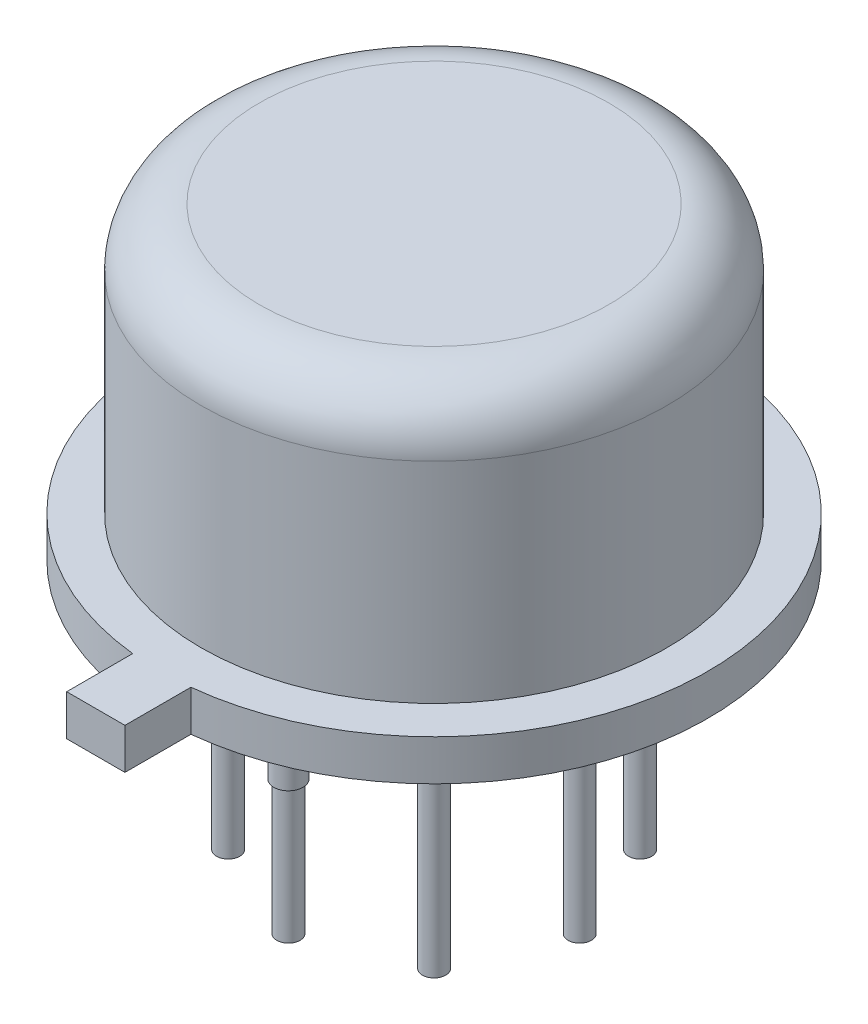
ISO-10303-21;
HEADER;
FILE_DESCRIPTION(('STEP AP214'),'2;1');
FILE_NAME('part.step','',(''),(''),'','','');
FILE_SCHEMA(('AUTOMOTIVE_DESIGN { 1 0 10303 214 1 1 1 1 }'));
ENDSEC;
DATA;
#1=APPLICATION_CONTEXT('core data for automotive mechanical design processes');
#2=APPLICATION_PROTOCOL_DEFINITION('international standard','automotive_design',2000,#1);
#3=PRODUCT_CONTEXT('',#1,'mechanical');
#4=PRODUCT('Part','Part','',(#3));
#5=PRODUCT_RELATED_PRODUCT_CATEGORY('part','',(#4));
#6=PRODUCT_DEFINITION_FORMATION('','',#4);
#7=PRODUCT_DEFINITION_CONTEXT('part definition',#1,'design');
#8=PRODUCT_DEFINITION('design','',#6,#7);
#9=PRODUCT_DEFINITION_SHAPE('','',#8);
#10=(LENGTH_UNIT() NAMED_UNIT(*) SI_UNIT(.MILLI.,.METRE.));
#11=(NAMED_UNIT(*) PLANE_ANGLE_UNIT() SI_UNIT($,.RADIAN.));
#12=(NAMED_UNIT(*) SI_UNIT($,.STERADIAN.) SOLID_ANGLE_UNIT());
#13=UNCERTAINTY_MEASURE_WITH_UNIT(LENGTH_MEASURE(1.E-05),#10,'distance_accuracy_value','');
#14=(GEOMETRIC_REPRESENTATION_CONTEXT(3) GLOBAL_UNCERTAINTY_ASSIGNED_CONTEXT((#13)) GLOBAL_UNIT_ASSIGNED_CONTEXT((#10,
#11,#12)) REPRESENTATION_CONTEXT('',''));
#15=CARTESIAN_POINT('',(0.,0.,0.));
#16=DIRECTION('',(0.,0.,1.));
#17=DIRECTION('',(1.,0.,0.));
#18=AXIS2_PLACEMENT_3D('',#15,#16,#17);
#19=CARTESIAN_POINT('',(0.,0.7,5.806112013031));
#20=DIRECTION('',(0.,0.,-1.));
#21=DIRECTION('',(-1.,0.,0.));
#22=AXIS2_PLACEMENT_3D('',#19,#20,#21);
#23=PLANE('',#22);
#24=DIRECTION('',(1.,0.,0.));
#25=VECTOR('',#24,1.);
#26=CARTESIAN_POINT('',(0.,0.,5.806112013031));
#27=LINE('',#26,#25);
#28=CARTESIAN_POINT('',(-0.499999999999999,0.,5.806112013031));
#29=VERTEX_POINT('',#28);
#30=CARTESIAN_POINT('',(0.500000000000001,0.,5.806112013031));
#31=VERTEX_POINT('',#30);
#32=EDGE_CURVE('E83',#29,#31,#27,.T.);
#33=ORIENTED_EDGE('',*,*,#32,.T.);
#34=DIRECTION('',(0.,-1.,0.));
#35=VECTOR('',#34,1.);
#36=CARTESIAN_POINT('',(0.500000000000001,0.7,5.806112013031));
#37=LINE('',#36,#35);
#38=CARTESIAN_POINT('',(0.500000000000001,0.7,5.806112013031));
#39=VERTEX_POINT('',#38);
#40=EDGE_CURVE('E104',#39,#31,#37,.T.);
#41=ORIENTED_EDGE('',*,*,#40,.F.);
#42=DIRECTION('',(1.,0.,0.));
#43=VECTOR('',#42,1.);
#44=CARTESIAN_POINT('',(0.,0.7,5.806112013031));
#45=LINE('',#44,#43);
#46=CARTESIAN_POINT('',(-0.499999999999999,0.7,5.806112013031));
#47=VERTEX_POINT('',#46);
#48=EDGE_CURVE('E88',#47,#39,#45,.T.);
#49=ORIENTED_EDGE('',*,*,#48,.F.);
#50=DIRECTION('',(0.,-1.,0.));
#51=VECTOR('',#50,1.);
#52=CARTESIAN_POINT('',(-0.499999999999999,0.7,5.806112013031));
#53=LINE('',#52,#51);
#54=EDGE_CURVE('E113',#47,#29,#53,.T.);
#55=ORIENTED_EDGE('',*,*,#54,.T.);
#56=EDGE_LOOP('',(#33,#41,#49,#55));
#57=FACE_BOUND('',#56,.T.);
#58=ADVANCED_FACE('F41',(#57),#23,.F.);
#59=CARTESIAN_POINT('',(0.500000000000001,0.7,5.806112013031));
#60=DIRECTION('',(-1.,0.,0.));
#61=DIRECTION('',(0.,0.,1.));
#62=AXIS2_PLACEMENT_3D('',#59,#60,#61);
#63=PLANE('',#62);
#64=DIRECTION('',(0.,0.,-1.));
#65=VECTOR('',#64,1.);
#66=CARTESIAN_POINT('',(0.500000000000001,0.,5.806112013031));
#67=LINE('',#66,#65);
#68=CARTESIAN_POINT('',(0.500000000000001,0.,4.67332857821917));
#69=VERTEX_POINT('',#68);
#70=EDGE_CURVE('E102',#31,#69,#67,.T.);
#71=ORIENTED_EDGE('',*,*,#70,.T.);
#72=DIRECTION('',(0.,-1.,0.));
#73=VECTOR('',#72,1.);
#74=CARTESIAN_POINT('',(0.500000000000001,0.7,4.67332857821917));
#75=LINE('',#74,#73);
#76=CARTESIAN_POINT('',(0.500000000000001,0.7,4.67332857821917));
#77=VERTEX_POINT('',#76);
#78=EDGE_CURVE('E100',#77,#69,#75,.T.);
#79=ORIENTED_EDGE('',*,*,#78,.F.);
#80=DIRECTION('',(0.,0.,-1.));
#81=VECTOR('',#80,1.);
#82=CARTESIAN_POINT('',(0.500000000000001,0.7,5.806112013031));
#83=LINE('',#82,#81);
#84=EDGE_CURVE('E91',#39,#77,#83,.T.);
#85=ORIENTED_EDGE('',*,*,#84,.F.);
#86=ORIENTED_EDGE('',*,*,#40,.T.);
#87=EDGE_LOOP('',(#71,#79,#85,#86));
#88=FACE_BOUND('',#87,.T.);
#89=ADVANCED_FACE('F101',(#88),#63,.F.);
#90=CARTESIAN_POINT('',(0.,0.7,0.));
#91=DIRECTION('',(0.,-1.,0.));
#92=DIRECTION('',(0.,0.,-1.));
#93=AXIS2_PLACEMENT_3D('',#90,#91,#92);
#94=CYLINDRICAL_SURFACE('',#93,4.7);
#95=CARTESIAN_POINT('',(0.,0.,0.));
#96=DIRECTION('',(0.,1.,0.));
#97=DIRECTION('',(0.,0.,1.));
#98=AXIS2_PLACEMENT_3D('',#95,#96,#97);
#99=CIRCLE('',#98,4.7);
#100=CARTESIAN_POINT('',(-0.500000000000001,0.,4.67332857821917));
#101=VERTEX_POINT('',#100);
#102=EDGE_CURVE('E76',#69,#101,#99,.T.);
#103=ORIENTED_EDGE('',*,*,#102,.T.);
#104=DIRECTION('',(0.,-1.,0.));
#105=VECTOR('',#104,1.);
#106=CARTESIAN_POINT('',(-0.500000000000001,0.7,4.67332857821917));
#107=LINE('',#106,#105);
#108=CARTESIAN_POINT('',(-0.500000000000001,0.7,4.67332857821917));
#109=VERTEX_POINT('',#108);
#110=EDGE_CURVE('E105',#109,#101,#107,.T.);
#111=ORIENTED_EDGE('',*,*,#110,.F.);
#112=CARTESIAN_POINT('',(0.,0.7,0.));
#113=DIRECTION('',(0.,1.,0.));
#114=DIRECTION('',(0.,0.,1.));
#115=AXIS2_PLACEMENT_3D('',#112,#113,#114);
#116=CIRCLE('',#115,4.7);
#117=EDGE_CURVE('E95',#77,#109,#116,.T.);
#118=ORIENTED_EDGE('',*,*,#117,.F.);
#119=ORIENTED_EDGE('',*,*,#78,.T.);
#120=EDGE_LOOP('',(#103,#111,#118,#119));
#121=FACE_BOUND('',#120,.T.);
#122=ADVANCED_FACE('F107',(#121),#94,.T.);
#123=CARTESIAN_POINT('',(-0.499999999999999,0.7,5.806112013031));
#124=DIRECTION('',(1.,0.,0.));
#125=DIRECTION('',(0.,0.,-1.));
#126=AXIS2_PLACEMENT_3D('',#123,#124,#125);
#127=PLANE('',#126);
#128=DIRECTION('',(0.,0.,1.));
#129=VECTOR('',#128,1.);
#130=CARTESIAN_POINT('',(-0.499999999999999,0.,5.806112013031));
#131=LINE('',#130,#129);
#132=EDGE_CURVE('E124',#101,#29,#131,.T.);
#133=ORIENTED_EDGE('',*,*,#132,.T.);
#134=ORIENTED_EDGE('',*,*,#54,.F.);
#135=DIRECTION('',(0.,0.,1.));
#136=VECTOR('',#135,1.);
#137=CARTESIAN_POINT('',(-0.499999999999999,0.7,5.806112013031));
#138=LINE('',#137,#136);
#139=EDGE_CURVE('E59',#109,#47,#138,.T.);
#140=ORIENTED_EDGE('',*,*,#139,.F.);
#141=ORIENTED_EDGE('',*,*,#110,.T.);
#142=EDGE_LOOP('',(#133,#134,#140,#141));
#143=FACE_BOUND('',#142,.T.);
#144=ADVANCED_FACE('F219',(#143),#127,.F.);
#145=CARTESIAN_POINT('',(0.,0.7,0.));
#146=DIRECTION('',(0.,1.,0.));
#147=DIRECTION('',(0.,0.,1.));
#148=AXIS2_PLACEMENT_3D('',#145,#146,#147);
#149=PLANE('',#148);
#150=CARTESIAN_POINT('',(0.,0.7,0.));
#151=DIRECTION('',(0.,1.,0.));
#152=DIRECTION('',(0.,0.,1.));
#153=AXIS2_PLACEMENT_3D('',#150,#151,#152);
#154=CIRCLE('',#153,4.);
#155=CARTESIAN_POINT('',(0.,0.7,4.));
#156=VERTEX_POINT('',#155);
#157=EDGE_CURVE('E119',#156,#156,#154,.T.);
#158=ORIENTED_EDGE('',*,*,#157,.F.);
#159=EDGE_LOOP('',(#158));
#160=FACE_BOUND('',#159,.T.);
#161=ORIENTED_EDGE('',*,*,#48,.T.);
#162=ORIENTED_EDGE('',*,*,#84,.T.);
#163=ORIENTED_EDGE('',*,*,#117,.T.);
#164=ORIENTED_EDGE('',*,*,#139,.T.);
#165=EDGE_LOOP('',(#161,#162,#163,#164));
#166=FACE_BOUND('',#165,.T.);
#167=ADVANCED_FACE('F93',(#160,#166),#149,.T.);
#168=CARTESIAN_POINT('',(0.,0.,0.));
#169=DIRECTION('',(0.,1.,0.));
#170=DIRECTION('',(0.,0.,1.));
#171=AXIS2_PLACEMENT_3D('',#168,#169,#170);
#172=PLANE('',#171);
#173=CARTESIAN_POINT('',(0.,0.,2.5));
#174=DIRECTION('',(0.,1.,0.));
#175=DIRECTION('',(0.,0.,1.));
#176=AXIS2_PLACEMENT_3D('',#173,#174,#175);
#177=CIRCLE('',#176,0.25);
#178=CARTESIAN_POINT('',(0.,0.,2.75));
#179=VERTEX_POINT('',#178);
#180=EDGE_CURVE('E11',#179,#179,#177,.F.);
#181=ORIENTED_EDGE('',*,*,#180,.F.);
#182=EDGE_LOOP('',(#181));
#183=FACE_BOUND('',#182,.T.);
#184=CARTESIAN_POINT('',(1.76776695296635,0.,1.76776695296638));
#185=DIRECTION('',(0.,1.,0.));
#186=DIRECTION('',(0.,0.,1.));
#187=AXIS2_PLACEMENT_3D('',#184,#185,#186);
#188=CIRCLE('',#187,0.2);
#189=CARTESIAN_POINT('',(1.76776695296635,0.,1.96776695296638));
#190=VERTEX_POINT('',#189);
#191=EDGE_CURVE('E51',#190,#190,#188,.F.);
#192=ORIENTED_EDGE('',*,*,#191,.F.);
#193=EDGE_LOOP('',(#192));
#194=FACE_BOUND('',#193,.T.);
#195=CARTESIAN_POINT('',(-1.76776695296639,0.,1.76776695296635));
#196=DIRECTION('',(0.,1.,0.));
#197=DIRECTION('',(0.,0.,1.));
#198=AXIS2_PLACEMENT_3D('',#195,#196,#197);
#199=CIRCLE('',#198,0.2);
#200=CARTESIAN_POINT('',(-1.76776695296639,0.,1.96776695296635));
#201=VERTEX_POINT('',#200);
#202=EDGE_CURVE('E161',#201,#201,#199,.F.);
#203=ORIENTED_EDGE('',*,*,#202,.F.);
#204=EDGE_LOOP('',(#203));
#205=FACE_BOUND('',#204,.T.);
#206=CARTESIAN_POINT('',(-2.5,0.,0.));
#207=DIRECTION('',(0.,1.,0.));
#208=DIRECTION('',(0.,0.,1.));
#209=AXIS2_PLACEMENT_3D('',#206,#207,#208);
#210=CIRCLE('',#209,0.2);
#211=CARTESIAN_POINT('',(-2.5,0.,0.2));
#212=VERTEX_POINT('',#211);
#213=EDGE_CURVE('E157',#212,#212,#210,.F.);
#214=ORIENTED_EDGE('',*,*,#213,.F.);
#215=EDGE_LOOP('',(#214));
#216=FACE_BOUND('',#215,.T.);
#217=CARTESIAN_POINT('',(-1.76776695296635,0.,-1.76776695296638));
#218=DIRECTION('',(0.,1.,0.));
#219=DIRECTION('',(0.,0.,1.));
#220=AXIS2_PLACEMENT_3D('',#217,#218,#219);
#221=CIRCLE('',#220,0.2);
#222=CARTESIAN_POINT('',(-1.76776695296635,0.,-1.56776695296638));
#223=VERTEX_POINT('',#222);
#224=EDGE_CURVE('E153',#223,#223,#221,.F.);
#225=ORIENTED_EDGE('',*,*,#224,.F.);
#226=EDGE_LOOP('',(#225));
#227=FACE_BOUND('',#226,.T.);
#228=CARTESIAN_POINT('',(0.,0.,-2.5));
#229=DIRECTION('',(0.,1.,0.));
#230=DIRECTION('',(0.,0.,1.));
#231=AXIS2_PLACEMENT_3D('',#228,#229,#230);
#232=CIRCLE('',#231,0.2);
#233=CARTESIAN_POINT('',(0.,0.,-2.3));
#234=VERTEX_POINT('',#233);
#235=EDGE_CURVE('E149',#234,#234,#232,.F.);
#236=ORIENTED_EDGE('',*,*,#235,.F.);
#237=EDGE_LOOP('',(#236));
#238=FACE_BOUND('',#237,.T.);
#239=CARTESIAN_POINT('',(1.76776695296638,0.,-1.76776695296635));
#240=DIRECTION('',(0.,1.,0.));
#241=DIRECTION('',(0.,0.,1.));
#242=AXIS2_PLACEMENT_3D('',#239,#240,#241);
#243=CIRCLE('',#242,0.2);
#244=CARTESIAN_POINT('',(1.76776695296638,0.,-1.56776695296635));
#245=VERTEX_POINT('',#244);
#246=EDGE_CURVE('E145',#245,#245,#243,.F.);
#247=ORIENTED_EDGE('',*,*,#246,.F.);
#248=EDGE_LOOP('',(#247));
#249=FACE_BOUND('',#248,.T.);
#250=CARTESIAN_POINT('',(2.5,0.,0.));
#251=DIRECTION('',(0.,1.,0.));
#252=DIRECTION('',(0.,0.,1.));
#253=AXIS2_PLACEMENT_3D('',#250,#251,#252);
#254=CIRCLE('',#253,0.2);
#255=CARTESIAN_POINT('',(2.5,0.,0.2));
#256=VERTEX_POINT('',#255);
#257=EDGE_CURVE('E141',#256,#256,#254,.F.);
#258=ORIENTED_EDGE('',*,*,#257,.F.);
#259=EDGE_LOOP('',(#258));
#260=FACE_BOUND('',#259,.T.);
#261=ORIENTED_EDGE('',*,*,#32,.F.);
#262=ORIENTED_EDGE('',*,*,#132,.F.);
#263=ORIENTED_EDGE('',*,*,#102,.F.);
#264=ORIENTED_EDGE('',*,*,#70,.F.);
#265=EDGE_LOOP('',(#261,#262,#263,#264));
#266=FACE_BOUND('',#265,.T.);
#267=ADVANCED_FACE('F218',(#183,#194,#205,#216,#227,#238,#249,#260,#266),#172,.F.);
#268=CARTESIAN_POINT('',(0.,5.3,0.));
#269=DIRECTION('',(0.,-1.,0.));
#270=DIRECTION('',(0.,0.,-1.));
#271=AXIS2_PLACEMENT_3D('',#268,#269,#270);
#272=CYLINDRICAL_SURFACE('',#271,4.);
#273=CARTESIAN_POINT('',(0.,4.3,0.));
#274=DIRECTION('',(0.,1.,0.));
#275=DIRECTION('',(0.,0.,1.));
#276=AXIS2_PLACEMENT_3D('',#273,#274,#275);
#277=CIRCLE('',#276,4.);
#278=CARTESIAN_POINT('',(0.,4.3,4.));
#279=VERTEX_POINT('',#278);
#280=EDGE_CURVE('E137',#279,#279,#277,.F.);
#281=ORIENTED_EDGE('',*,*,#280,.T.);
#282=EDGE_LOOP('',(#281));
#283=FACE_BOUND('',#282,.T.);
#284=ORIENTED_EDGE('',*,*,#157,.T.);
#285=EDGE_LOOP('',(#284));
#286=FACE_BOUND('',#285,.T.);
#287=ADVANCED_FACE('F215',(#283,#286),#272,.T.);
#288=CARTESIAN_POINT('',(0.,5.3,0.));
#289=DIRECTION('',(0.,1.,0.));
#290=DIRECTION('',(0.,0.,1.));
#291=AXIS2_PLACEMENT_3D('',#288,#289,#290);
#292=PLANE('',#291);
#293=CARTESIAN_POINT('',(0.,5.3,0.));
#294=DIRECTION('',(0.,1.,0.));
#295=DIRECTION('',(0.,0.,1.));
#296=AXIS2_PLACEMENT_3D('',#293,#294,#295);
#297=CIRCLE('',#296,3.);
#298=CARTESIAN_POINT('',(0.,5.3,3.));
#299=VERTEX_POINT('',#298);
#300=EDGE_CURVE('E133',#299,#299,#297,.T.);
#301=ORIENTED_EDGE('',*,*,#300,.T.);
#302=EDGE_LOOP('',(#301));
#303=FACE_BOUND('',#302,.T.);
#304=ADVANCED_FACE('F262',(#303),#292,.T.);
#305=CARTESIAN_POINT('',(0.,4.3,0.));
#306=DIRECTION('',(0.,1.,0.));
#307=DIRECTION('',(0.,0.,1.));
#308=AXIS2_PLACEMENT_3D('',#305,#306,#307);
#309=TOROIDAL_SURFACE('',#308,3.,1.);
#310=ORIENTED_EDGE('',*,*,#280,.F.);
#311=EDGE_LOOP('',(#310));
#312=FACE_BOUND('',#311,.T.);
#313=ORIENTED_EDGE('',*,*,#300,.F.);
#314=EDGE_LOOP('',(#313));
#315=FACE_BOUND('',#314,.T.);
#316=ADVANCED_FACE('F43',(#312,#315),#309,.T.);
#317=CARTESIAN_POINT('',(2.5,-4.3,0.));
#318=DIRECTION('',(0.,1.,0.));
#319=DIRECTION('',(0.,0.,1.));
#320=AXIS2_PLACEMENT_3D('',#317,#318,#319);
#321=CYLINDRICAL_SURFACE('',#320,0.2);
#322=CARTESIAN_POINT('',(2.5,-4.3,0.));
#323=DIRECTION('',(0.,-1.,0.));
#324=DIRECTION('',(0.,0.,-1.));
#325=AXIS2_PLACEMENT_3D('',#322,#323,#324);
#326=CIRCLE('',#325,0.2);
#327=CARTESIAN_POINT('',(2.5,-4.3,-0.2));
#328=VERTEX_POINT('',#327);
#329=EDGE_CURVE('E207',#328,#328,#326,.T.);
#330=ORIENTED_EDGE('',*,*,#329,.F.);
#331=EDGE_LOOP('',(#330));
#332=FACE_BOUND('',#331,.T.);
#333=ORIENTED_EDGE('',*,*,#257,.T.);
#334=EDGE_LOOP('',(#333));
#335=FACE_BOUND('',#334,.T.);
#336=ADVANCED_FACE('F278',(#332,#335),#321,.T.);
#337=CARTESIAN_POINT('',(2.5,-4.3,0.));
#338=DIRECTION('',(0.,-1.,0.));
#339=DIRECTION('',(0.,0.,-1.));
#340=AXIS2_PLACEMENT_3D('',#337,#338,#339);
#341=PLANE('',#340);
#342=ORIENTED_EDGE('',*,*,#329,.T.);
#343=EDGE_LOOP('',(#342));
#344=FACE_BOUND('',#343,.T.);
#345=ADVANCED_FACE('F287',(#344),#341,.T.);
#346=CARTESIAN_POINT('',(1.76776695296638,-4.3,-1.76776695296635));
#347=DIRECTION('',(0.,1.,0.));
#348=DIRECTION('',(0.,0.,1.));
#349=AXIS2_PLACEMENT_3D('',#346,#347,#348);
#350=CYLINDRICAL_SURFACE('',#349,0.2);
#351=CARTESIAN_POINT('',(1.76776695296638,-4.3,-1.76776695296635));
#352=DIRECTION('',(0.,-1.,0.));
#353=DIRECTION('',(0.,0.,-1.));
#354=AXIS2_PLACEMENT_3D('',#351,#352,#353);
#355=CIRCLE('',#354,0.2);
#356=CARTESIAN_POINT('',(1.76776695296638,-4.3,-1.96776695296635));
#357=VERTEX_POINT('',#356);
#358=EDGE_CURVE('E203',#357,#357,#355,.T.);
#359=ORIENTED_EDGE('',*,*,#358,.F.);
#360=EDGE_LOOP('',(#359));
#361=FACE_BOUND('',#360,.T.);
#362=ORIENTED_EDGE('',*,*,#246,.T.);
#363=EDGE_LOOP('',(#362));
#364=FACE_BOUND('',#363,.T.);
#365=ADVANCED_FACE('F297',(#361,#364),#350,.T.);
#366=CARTESIAN_POINT('',(1.76776695296638,-4.3,-1.76776695296635));
#367=DIRECTION('',(0.,-1.,0.));
#368=DIRECTION('',(0.,0.,-1.));
#369=AXIS2_PLACEMENT_3D('',#366,#367,#368);
#370=PLANE('',#369);
#371=ORIENTED_EDGE('',*,*,#358,.T.);
#372=EDGE_LOOP('',(#371));
#373=FACE_BOUND('',#372,.T.);
#374=ADVANCED_FACE('F307',(#373),#370,.T.);
#375=CARTESIAN_POINT('',(0.,-4.3,-2.5));
#376=DIRECTION('',(0.,1.,0.));
#377=DIRECTION('',(0.,0.,1.));
#378=AXIS2_PLACEMENT_3D('',#375,#376,#377);
#379=CYLINDRICAL_SURFACE('',#378,0.2);
#380=CARTESIAN_POINT('',(0.,-4.3,-2.5));
#381=DIRECTION('',(0.,-1.,0.));
#382=DIRECTION('',(0.,0.,-1.));
#383=AXIS2_PLACEMENT_3D('',#380,#381,#382);
#384=CIRCLE('',#383,0.2);
#385=CARTESIAN_POINT('',(0.,-4.3,-2.7));
#386=VERTEX_POINT('',#385);
#387=EDGE_CURVE('E199',#386,#386,#384,.T.);
#388=ORIENTED_EDGE('',*,*,#387,.F.);
#389=EDGE_LOOP('',(#388));
#390=FACE_BOUND('',#389,.T.);
#391=ORIENTED_EDGE('',*,*,#235,.T.);
#392=EDGE_LOOP('',(#391));
#393=FACE_BOUND('',#392,.T.);
#394=ADVANCED_FACE('F316',(#390,#393),#379,.T.);
#395=CARTESIAN_POINT('',(0.,-4.3,-2.5));
#396=DIRECTION('',(0.,-1.,0.));
#397=DIRECTION('',(0.,0.,-1.));
#398=AXIS2_PLACEMENT_3D('',#395,#396,#397);
#399=PLANE('',#398);
#400=ORIENTED_EDGE('',*,*,#387,.T.);
#401=EDGE_LOOP('',(#400));
#402=FACE_BOUND('',#401,.T.);
#403=ADVANCED_FACE('F325',(#402),#399,.T.);
#404=CARTESIAN_POINT('',(-1.76776695296635,-4.3,-1.76776695296638));
#405=DIRECTION('',(0.,1.,0.));
#406=DIRECTION('',(0.,0.,1.));
#407=AXIS2_PLACEMENT_3D('',#404,#405,#406);
#408=CYLINDRICAL_SURFACE('',#407,0.2);
#409=CARTESIAN_POINT('',(-1.76776695296635,-4.3,-1.76776695296638));
#410=DIRECTION('',(0.,-1.,0.));
#411=DIRECTION('',(0.,0.,-1.));
#412=AXIS2_PLACEMENT_3D('',#409,#410,#411);
#413=CIRCLE('',#412,0.2);
#414=CARTESIAN_POINT('',(-1.76776695296635,-4.3,-1.96776695296638));
#415=VERTEX_POINT('',#414);
#416=EDGE_CURVE('E195',#415,#415,#413,.T.);
#417=ORIENTED_EDGE('',*,*,#416,.F.);
#418=EDGE_LOOP('',(#417));
#419=FACE_BOUND('',#418,.T.);
#420=ORIENTED_EDGE('',*,*,#224,.T.);
#421=EDGE_LOOP('',(#420));
#422=FACE_BOUND('',#421,.T.);
#423=ADVANCED_FACE('F333',(#419,#422),#408,.T.);
#424=CARTESIAN_POINT('',(-1.76776695296635,-4.3,-1.76776695296638));
#425=DIRECTION('',(0.,-1.,0.));
#426=DIRECTION('',(0.,0.,-1.));
#427=AXIS2_PLACEMENT_3D('',#424,#425,#426);
#428=PLANE('',#427);
#429=ORIENTED_EDGE('',*,*,#416,.T.);
#430=EDGE_LOOP('',(#429));
#431=FACE_BOUND('',#430,.T.);
#432=ADVANCED_FACE('F342',(#431),#428,.T.);
#433=CARTESIAN_POINT('',(-2.5,-4.3,0.));
#434=DIRECTION('',(0.,1.,0.));
#435=DIRECTION('',(0.,0.,1.));
#436=AXIS2_PLACEMENT_3D('',#433,#434,#435);
#437=CYLINDRICAL_SURFACE('',#436,0.2);
#438=CARTESIAN_POINT('',(-2.5,-4.3,0.));
#439=DIRECTION('',(0.,-1.,0.));
#440=DIRECTION('',(0.,0.,-1.));
#441=AXIS2_PLACEMENT_3D('',#438,#439,#440);
#442=CIRCLE('',#441,0.2);
#443=CARTESIAN_POINT('',(-2.5,-4.3,-0.2));
#444=VERTEX_POINT('',#443);
#445=EDGE_CURVE('E191',#444,#444,#442,.T.);
#446=ORIENTED_EDGE('',*,*,#445,.F.);
#447=EDGE_LOOP('',(#446));
#448=FACE_BOUND('',#447,.T.);
#449=ORIENTED_EDGE('',*,*,#213,.T.);
#450=EDGE_LOOP('',(#449));
#451=FACE_BOUND('',#450,.T.);
#452=ADVANCED_FACE('F351',(#448,#451),#437,.T.);
#453=CARTESIAN_POINT('',(-2.5,-4.3,0.));
#454=DIRECTION('',(0.,-1.,0.));
#455=DIRECTION('',(0.,0.,-1.));
#456=AXIS2_PLACEMENT_3D('',#453,#454,#455);
#457=PLANE('',#456);
#458=ORIENTED_EDGE('',*,*,#445,.T.);
#459=EDGE_LOOP('',(#458));
#460=FACE_BOUND('',#459,.T.);
#461=ADVANCED_FACE('F361',(#460),#457,.T.);
#462=CARTESIAN_POINT('',(-1.76776695296639,-4.3,1.76776695296635));
#463=DIRECTION('',(0.,1.,0.));
#464=DIRECTION('',(0.,0.,1.));
#465=AXIS2_PLACEMENT_3D('',#462,#463,#464);
#466=CYLINDRICAL_SURFACE('',#465,0.2);
#467=CARTESIAN_POINT('',(-1.76776695296639,-4.3,1.76776695296635));
#468=DIRECTION('',(0.,-1.,0.));
#469=DIRECTION('',(0.,0.,-1.));
#470=AXIS2_PLACEMENT_3D('',#467,#468,#469);
#471=CIRCLE('',#470,0.2);
#472=CARTESIAN_POINT('',(-1.76776695296639,-4.3,1.56776695296635));
#473=VERTEX_POINT('',#472);
#474=EDGE_CURVE('E187',#473,#473,#471,.T.);
#475=ORIENTED_EDGE('',*,*,#474,.F.);
#476=EDGE_LOOP('',(#475));
#477=FACE_BOUND('',#476,.T.);
#478=ORIENTED_EDGE('',*,*,#202,.T.);
#479=EDGE_LOOP('',(#478));
#480=FACE_BOUND('',#479,.T.);
#481=ADVANCED_FACE('F370',(#477,#480),#466,.T.);
#482=CARTESIAN_POINT('',(-1.76776695296639,-4.3,1.76776695296635));
#483=DIRECTION('',(0.,-1.,0.));
#484=DIRECTION('',(0.,0.,-1.));
#485=AXIS2_PLACEMENT_3D('',#482,#483,#484);
#486=PLANE('',#485);
#487=ORIENTED_EDGE('',*,*,#474,.T.);
#488=EDGE_LOOP('',(#487));
#489=FACE_BOUND('',#488,.T.);
#490=ADVANCED_FACE('F379',(#489),#486,.T.);
#491=CARTESIAN_POINT('',(1.76776695296635,-4.3,1.76776695296638));
#492=DIRECTION('',(0.,1.,0.));
#493=DIRECTION('',(0.,0.,1.));
#494=AXIS2_PLACEMENT_3D('',#491,#492,#493);
#495=CYLINDRICAL_SURFACE('',#494,0.2);
#496=CARTESIAN_POINT('',(1.76776695296635,-4.3,1.76776695296638));
#497=DIRECTION('',(0.,-1.,0.));
#498=DIRECTION('',(0.,0.,-1.));
#499=AXIS2_PLACEMENT_3D('',#496,#497,#498);
#500=CIRCLE('',#499,0.2);
#501=CARTESIAN_POINT('',(1.76776695296635,-4.3,1.56776695296638));
#502=VERTEX_POINT('',#501);
#503=EDGE_CURVE('E170',#502,#502,#500,.T.);
#504=ORIENTED_EDGE('',*,*,#503,.F.);
#505=EDGE_LOOP('',(#504));
#506=FACE_BOUND('',#505,.T.);
#507=ORIENTED_EDGE('',*,*,#191,.T.);
#508=EDGE_LOOP('',(#507));
#509=FACE_BOUND('',#508,.T.);
#510=ADVANCED_FACE('F388',(#506,#509),#495,.T.);
#511=CARTESIAN_POINT('',(1.76776695296635,-4.3,1.76776695296638));
#512=DIRECTION('',(0.,-1.,0.));
#513=DIRECTION('',(0.,0.,-1.));
#514=AXIS2_PLACEMENT_3D('',#511,#512,#513);
#515=PLANE('',#514);
#516=ORIENTED_EDGE('',*,*,#503,.T.);
#517=EDGE_LOOP('',(#516));
#518=FACE_BOUND('',#517,.T.);
#519=ADVANCED_FACE('F397',(#518),#515,.T.);
#520=CARTESIAN_POINT('',(0.,-2.,2.5));
#521=DIRECTION('',(0.,1.,0.));
#522=DIRECTION('',(0.,0.,1.));
#523=AXIS2_PLACEMENT_3D('',#520,#521,#522);
#524=CYLINDRICAL_SURFACE('',#523,0.25);
#525=CARTESIAN_POINT('',(0.,-2.,2.5));
#526=DIRECTION('',(0.,-1.,0.));
#527=DIRECTION('',(0.,0.,-1.));
#528=AXIS2_PLACEMENT_3D('',#525,#526,#527);
#529=CIRCLE('',#528,0.25);
#530=CARTESIAN_POINT('',(0.,-2.,2.25));
#531=VERTEX_POINT('',#530);
#532=EDGE_CURVE('E171',#531,#531,#529,.T.);
#533=ORIENTED_EDGE('',*,*,#532,.F.);
#534=EDGE_LOOP('',(#533));
#535=FACE_BOUND('',#534,.T.);
#536=ORIENTED_EDGE('',*,*,#180,.T.);
#537=EDGE_LOOP('',(#536));
#538=FACE_BOUND('',#537,.T.);
#539=ADVANCED_FACE('F405',(#535,#538),#524,.T.);
#540=CARTESIAN_POINT('',(0.,-2.,2.5));
#541=DIRECTION('',(0.,-1.,0.));
#542=DIRECTION('',(0.,0.,-1.));
#543=AXIS2_PLACEMENT_3D('',#540,#541,#542);
#544=PLANE('',#543);
#545=CARTESIAN_POINT('',(0.,-2.,2.5));
#546=DIRECTION('',(0.,-1.,0.));
#547=DIRECTION('',(0.,0.,-1.));
#548=AXIS2_PLACEMENT_3D('',#545,#546,#547);
#549=CIRCLE('',#548,0.2);
#550=CARTESIAN_POINT('',(0.,-2.,2.3));
#551=VERTEX_POINT('',#550);
#552=EDGE_CURVE('E167',#551,#551,#549,.T.);
#553=ORIENTED_EDGE('',*,*,#552,.F.);
#554=EDGE_LOOP('',(#553));
#555=FACE_BOUND('',#554,.T.);
#556=ORIENTED_EDGE('',*,*,#532,.T.);
#557=EDGE_LOOP('',(#556));
#558=FACE_BOUND('',#557,.T.);
#559=ADVANCED_FACE('F413',(#555,#558),#544,.T.);
#560=CARTESIAN_POINT('',(0.,-4.3,2.5));
#561=DIRECTION('',(0.,-1.,0.));
#562=DIRECTION('',(0.,0.,-1.));
#563=AXIS2_PLACEMENT_3D('',#560,#561,#562);
#564=PLANE('',#563);
#565=CARTESIAN_POINT('',(0.,-4.3,2.5));
#566=DIRECTION('',(0.,-1.,0.));
#567=DIRECTION('',(0.,0.,-1.));
#568=AXIS2_PLACEMENT_3D('',#565,#566,#567);
#569=CIRCLE('',#568,0.2);
#570=CARTESIAN_POINT('',(0.,-4.3,2.3));
#571=VERTEX_POINT('',#570);
#572=EDGE_CURVE('E177',#571,#571,#569,.T.);
#573=ORIENTED_EDGE('',*,*,#572,.T.);
#574=EDGE_LOOP('',(#573));
#575=FACE_BOUND('',#574,.T.);
#576=ADVANCED_FACE('F421',(#575),#564,.T.);
#577=CARTESIAN_POINT('',(0.,-4.3,2.5));
#578=DIRECTION('',(0.,1.,0.));
#579=DIRECTION('',(0.,0.,1.));
#580=AXIS2_PLACEMENT_3D('',#577,#578,#579);
#581=CYLINDRICAL_SURFACE('',#580,0.2);
#582=ORIENTED_EDGE('',*,*,#552,.T.);
#583=EDGE_LOOP('',(#582));
#584=FACE_BOUND('',#583,.T.);
#585=ORIENTED_EDGE('',*,*,#572,.F.);
#586=EDGE_LOOP('',(#585));
#587=FACE_BOUND('',#586,.T.);
#588=ADVANCED_FACE('F429',(#584,#587),#581,.T.);
#589=CLOSED_SHELL('',(#58,#89,#122,#144,#167,#267,#287,#304,#316,#336,#345,#365,#374,#394,#403,
#423,#432,#452,#461,#481,#490,#510,#519,#539,#559,#576,#588));
#590=MANIFOLD_SOLID_BREP('B2',#589);
#591=ADVANCED_BREP_SHAPE_REPRESENTATION('',(#18,#590),#14);
#592=SHAPE_DEFINITION_REPRESENTATION(#9,#591);
ENDSEC;
END-ISO-10303-21;
